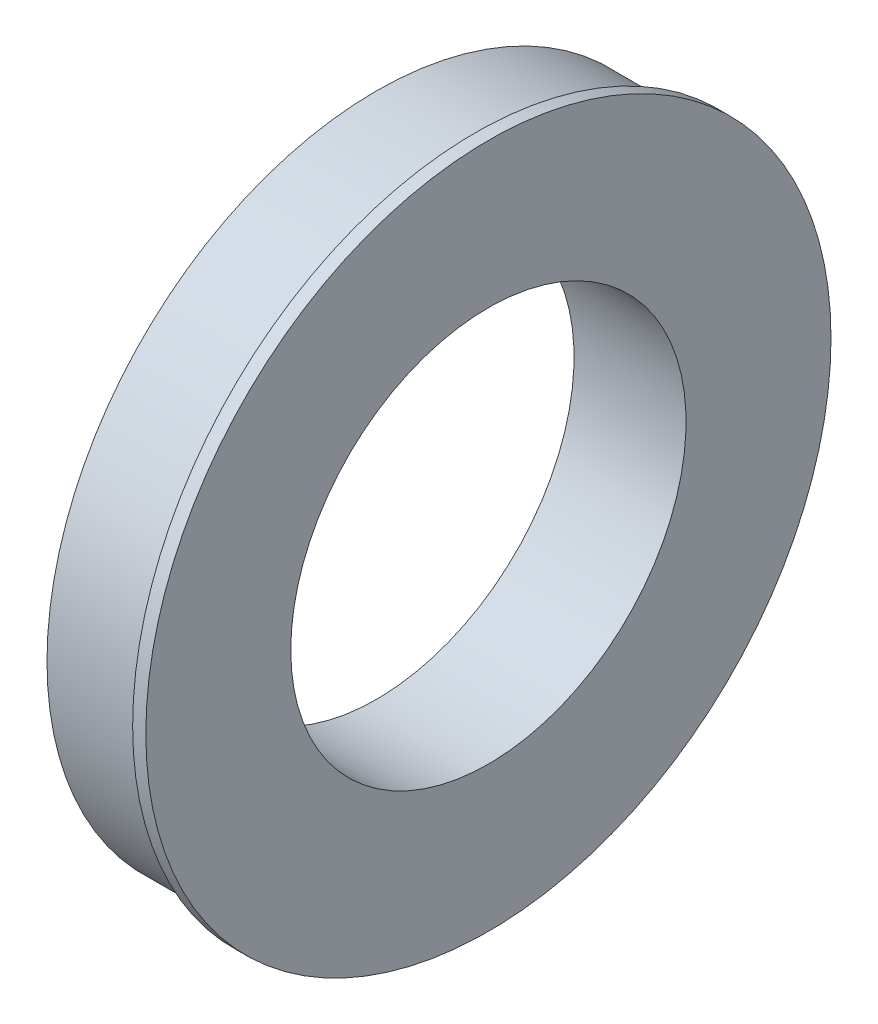
ISO-10303-21;
HEADER;
FILE_DESCRIPTION(('STEP AP214'),'2;1');
FILE_NAME('part.step','',(''),(''),'','','');
FILE_SCHEMA(('AUTOMOTIVE_DESIGN { 1 0 10303 214 1 1 1 1 }'));
ENDSEC;
DATA;
#1=APPLICATION_CONTEXT('core data for automotive mechanical design processes');
#2=APPLICATION_PROTOCOL_DEFINITION('international standard','automotive_design',2000,#1);
#3=PRODUCT_CONTEXT('',#1,'mechanical');
#4=PRODUCT('Part','Part','',(#3));
#5=PRODUCT_RELATED_PRODUCT_CATEGORY('part','',(#4));
#6=PRODUCT_DEFINITION_FORMATION('','',#4);
#7=PRODUCT_DEFINITION_CONTEXT('part definition',#1,'design');
#8=PRODUCT_DEFINITION('design','',#6,#7);
#9=PRODUCT_DEFINITION_SHAPE('','',#8);
#10=(LENGTH_UNIT() NAMED_UNIT(*) SI_UNIT(.MILLI.,.METRE.));
#11=(NAMED_UNIT(*) PLANE_ANGLE_UNIT() SI_UNIT($,.RADIAN.));
#12=(NAMED_UNIT(*) SI_UNIT($,.STERADIAN.) SOLID_ANGLE_UNIT());
#13=UNCERTAINTY_MEASURE_WITH_UNIT(LENGTH_MEASURE(1.E-05),#10,'distance_accuracy_value','');
#14=(GEOMETRIC_REPRESENTATION_CONTEXT(3) GLOBAL_UNCERTAINTY_ASSIGNED_CONTEXT((#13)) GLOBAL_UNIT_ASSIGNED_CONTEXT((#10,
#11,#12)) REPRESENTATION_CONTEXT('',''));
#15=CARTESIAN_POINT('',(0.,0.,0.));
#16=DIRECTION('',(0.,0.,1.));
#17=DIRECTION('',(1.,0.,0.));
#18=AXIS2_PLACEMENT_3D('',#15,#16,#17);
#19=CARTESIAN_POINT('',(0.,0.,0.));
#20=DIRECTION('',(1.,0.,0.));
#21=DIRECTION('',(0.,0.,-1.));
#22=AXIS2_PLACEMENT_3D('',#19,#20,#21);
#23=PLANE('',#22);
#24=CARTESIAN_POINT('',(0.,0.,0.));
#25=DIRECTION('',(1.,0.,0.));
#26=DIRECTION('',(0.,0.,-1.));
#27=AXIS2_PLACEMENT_3D('',#24,#25,#26);
#28=CIRCLE('',#27,63.5);
#29=CARTESIAN_POINT('',(0.,0.,63.5));
#30=VERTEX_POINT('',#29);
#31=EDGE_CURVE('E41',#30,#30,#28,.T.);
#32=ORIENTED_EDGE('',*,*,#31,.F.);
#33=EDGE_LOOP('',(#32));
#34=FACE_BOUND('',#33,.T.);
#35=CARTESIAN_POINT('',(0.,0.,0.));
#36=DIRECTION('',(1.,0.,0.));
#37=DIRECTION('',(0.,0.,-1.));
#38=AXIS2_PLACEMENT_3D('',#35,#36,#37);
#39=CIRCLE('',#38,38.1);
#40=CARTESIAN_POINT('',(0.,0.,38.1));
#41=VERTEX_POINT('',#40);
#42=EDGE_CURVE('E50',#41,#41,#39,.T.);
#43=ORIENTED_EDGE('',*,*,#42,.T.);
#44=EDGE_LOOP('',(#43));
#45=FACE_BOUND('',#44,.T.);
#46=ADVANCED_FACE('F37',(#34,#45),#23,.F.);
#47=CARTESIAN_POINT('',(19.05,0.,0.));
#48=DIRECTION('',(-1.,0.,0.));
#49=DIRECTION('',(0.,0.,1.));
#50=AXIS2_PLACEMENT_3D('',#47,#48,#49);
#51=CYLINDRICAL_SURFACE('',#50,63.5);
#52=CARTESIAN_POINT('',(19.05,0.,0.));
#53=DIRECTION('',(1.,0.,0.));
#54=DIRECTION('',(0.,0.,-1.));
#55=AXIS2_PLACEMENT_3D('',#52,#53,#54);
#56=CIRCLE('',#55,63.5);
#57=CARTESIAN_POINT('',(19.05,0.,63.5));
#58=VERTEX_POINT('',#57);
#59=EDGE_CURVE('E10',#58,#58,#56,.T.);
#60=CARTESIAN_POINT('',(19.05,0.,63.5));
#61=CARTESIAN_POINT('',(18.8515625,0.,63.5));
#62=CARTESIAN_POINT('',(18.653125,0.,63.5));
#63=CARTESIAN_POINT('',(18.25625,0.,63.5));
#64=CARTESIAN_POINT('',(18.0578125,0.,63.5));
#65=CARTESIAN_POINT('',(17.6609375,0.,63.5));
#66=CARTESIAN_POINT('',(17.4625,0.,63.5));
#67=CARTESIAN_POINT('',(17.065625,0.,63.5));
#68=CARTESIAN_POINT('',(16.8671875,0.,63.5));
#69=CARTESIAN_POINT('',(16.4703125,0.,63.5));
#70=CARTESIAN_POINT('',(16.271875,0.,63.5));
#71=CARTESIAN_POINT('',(15.875,0.,63.5));
#72=CARTESIAN_POINT('',(15.6765625,0.,63.5));
#73=CARTESIAN_POINT('',(15.2796875,0.,63.5));
#74=CARTESIAN_POINT('',(15.08125,0.,63.5));
#75=CARTESIAN_POINT('',(14.684375,0.,63.5));
#76=CARTESIAN_POINT('',(14.4859375,0.,63.5));
#77=CARTESIAN_POINT('',(14.0890625,0.,63.5));
#78=CARTESIAN_POINT('',(13.890625,0.,63.5));
#79=CARTESIAN_POINT('',(13.49375,0.,63.5));
#80=CARTESIAN_POINT('',(13.2953125,0.,63.5));
#81=CARTESIAN_POINT('',(12.8984375,0.,63.5));
#82=CARTESIAN_POINT('',(12.7,0.,63.5));
#83=CARTESIAN_POINT('',(12.303125,0.,63.5));
#84=CARTESIAN_POINT('',(12.1046875,0.,63.5));
#85=CARTESIAN_POINT('',(11.7078125,0.,63.5));
#86=CARTESIAN_POINT('',(11.509375,0.,63.5));
#87=CARTESIAN_POINT('',(11.1125,0.,63.5));
#88=CARTESIAN_POINT('',(10.9140625,0.,63.5));
#89=CARTESIAN_POINT('',(10.5171875,0.,63.5));
#90=CARTESIAN_POINT('',(10.31875,0.,63.5));
#91=CARTESIAN_POINT('',(9.921875,0.,63.5));
#92=CARTESIAN_POINT('',(9.7234375,0.,63.5));
#93=CARTESIAN_POINT('',(9.3265625,0.,63.5));
#94=CARTESIAN_POINT('',(9.128125,0.,63.5));
#95=CARTESIAN_POINT('',(8.73125,0.,63.5));
#96=CARTESIAN_POINT('',(8.5328125,0.,63.5));
#97=CARTESIAN_POINT('',(8.1359375,0.,63.5));
#98=CARTESIAN_POINT('',(7.9375,0.,63.5));
#99=CARTESIAN_POINT('',(7.540625,0.,63.5));
#100=CARTESIAN_POINT('',(7.3421875,0.,63.5));
#101=CARTESIAN_POINT('',(6.9453125,0.,63.5));
#102=CARTESIAN_POINT('',(6.746875,0.,63.5));
#103=CARTESIAN_POINT('',(6.35,0.,63.5));
#104=CARTESIAN_POINT('',(6.1515625,0.,63.5));
#105=CARTESIAN_POINT('',(5.7546875,0.,63.5));
#106=CARTESIAN_POINT('',(5.55625,0.,63.5));
#107=CARTESIAN_POINT('',(5.159375,0.,63.5));
#108=CARTESIAN_POINT('',(4.9609375,0.,63.5));
#109=CARTESIAN_POINT('',(4.5640625,0.,63.5));
#110=CARTESIAN_POINT('',(4.365625,0.,63.5));
#111=CARTESIAN_POINT('',(3.96875,0.,63.5));
#112=CARTESIAN_POINT('',(3.7703125,0.,63.5));
#113=CARTESIAN_POINT('',(3.3734375,0.,63.5));
#114=CARTESIAN_POINT('',(3.175,0.,63.5));
#115=CARTESIAN_POINT('',(2.778125,0.,63.5));
#116=CARTESIAN_POINT('',(2.5796875,0.,63.5));
#117=CARTESIAN_POINT('',(2.1828125,0.,63.5));
#118=CARTESIAN_POINT('',(1.984375,0.,63.5));
#119=CARTESIAN_POINT('',(1.5875,0.,63.5));
#120=CARTESIAN_POINT('',(1.3890625,0.,63.5));
#121=CARTESIAN_POINT('',(0.992187500000001,0.,63.5));
#122=CARTESIAN_POINT('',(0.793750000000001,0.,63.5));
#123=CARTESIAN_POINT('',(0.396875,0.,63.5));
#124=CARTESIAN_POINT('',(0.1984375,0.,63.5));
#125=CARTESIAN_POINT('',(0.,0.,63.5));
#126=B_SPLINE_CURVE_WITH_KNOTS('',3,(#60,#61,#62,#63,#64,#65,#66,#67,#68,#69,#70,#71,#72,#73,
#74,#75,#76,#77,#78,#79,#80,#81,#82,#83,#84,#85,#86,#87,#88,#89,#90,#91,#92,#93,#94,#95,#96,#97,
#98,#99,#100,#101,#102,#103,#104,#105,#106,#107,#108,#109,#110,#111,#112,#113,#114,#115,#116,
#117,#118,#119,#120,#121,#122,#123,#124,#125),.UNSPECIFIED.,.F.,.F.,(4,2,2,2,2,2,2,2,2,2,2,2,2,
2,2,2,2,2,2,2,2,2,2,2,2,2,2,2,2,2,2,2,4),(0.,0.5953125,1.190625,1.7859375,2.38125,2.9765625,
3.571875,4.1671875,4.7625,5.3578125,5.953125,6.5484375,7.14375,7.7390625,8.334375,8.9296875,
9.525,10.1203125,10.715625,11.3109375,11.90625,12.5015625,13.096875,13.6921875,14.2875,
14.8828125,15.478125,16.0734375,16.66875,17.2640625,17.859375,18.4546875,19.05),.UNSPECIFIED.);
#127=EDGE_CURVE('BSEAM39',#58,#30,#126,.T.);
#128=ORIENTED_EDGE('',*,*,#59,.F.);
#129=ORIENTED_EDGE('',*,*,#31,.T.);
#130=ORIENTED_EDGE('',*,*,#127,.T.);
#131=ORIENTED_EDGE('',*,*,#127,.F.);
#132=EDGE_LOOP('',(#128,#130,#129,#131));
#133=FACE_BOUND('',#132,.T.);
#134=ADVANCED_FACE('F39',(#133),#51,.T.);
#135=CARTESIAN_POINT('',(19.05,0.,0.));
#136=DIRECTION('',(-1.,0.,0.));
#137=DIRECTION('',(0.,0.,1.));
#138=AXIS2_PLACEMENT_3D('',#135,#136,#137);
#139=CYLINDRICAL_SURFACE('',#138,38.1);
#140=CARTESIAN_POINT('',(21.59,0.,0.));
#141=DIRECTION('',(1.,0.,0.));
#142=DIRECTION('',(0.,0.,-1.));
#143=AXIS2_PLACEMENT_3D('',#140,#141,#142);
#144=CIRCLE('',#143,38.1);
#145=CARTESIAN_POINT('',(21.59,0.,38.1));
#146=VERTEX_POINT('',#145);
#147=EDGE_CURVE('E60',#146,#146,#144,.T.);
#148=CARTESIAN_POINT('',(0.,0.,38.1));
#149=CARTESIAN_POINT('',(0.224895833333333,0.,38.1));
#150=CARTESIAN_POINT('',(0.449791666666667,0.,38.1));
#151=CARTESIAN_POINT('',(0.899583333333333,0.,38.1));
#152=CARTESIAN_POINT('',(1.12447916666667,0.,38.1));
#153=CARTESIAN_POINT('',(1.57427083333333,0.,38.1));
#154=CARTESIAN_POINT('',(1.79916666666667,0.,38.1));
#155=CARTESIAN_POINT('',(2.24895833333333,0.,38.1));
#156=CARTESIAN_POINT('',(2.47385416666667,0.,38.1));
#157=CARTESIAN_POINT('',(2.92364583333333,0.,38.1));
#158=CARTESIAN_POINT('',(3.14854166666667,0.,38.1));
#159=CARTESIAN_POINT('',(3.59833333333333,0.,38.1));
#160=CARTESIAN_POINT('',(3.82322916666667,0.,38.1));
#161=CARTESIAN_POINT('',(4.27302083333333,0.,38.1));
#162=CARTESIAN_POINT('',(4.49791666666667,0.,38.1));
#163=CARTESIAN_POINT('',(4.94770833333333,0.,38.1));
#164=CARTESIAN_POINT('',(5.17260416666667,0.,38.1));
#165=CARTESIAN_POINT('',(5.62239583333333,0.,38.1));
#166=CARTESIAN_POINT('',(5.84729166666667,0.,38.1));
#167=CARTESIAN_POINT('',(6.29708333333333,0.,38.1));
#168=CARTESIAN_POINT('',(6.52197916666667,0.,38.1));
#169=CARTESIAN_POINT('',(6.97177083333333,0.,38.1));
#170=CARTESIAN_POINT('',(7.19666666666667,0.,38.1));
#171=CARTESIAN_POINT('',(7.64645833333333,0.,38.1));
#172=CARTESIAN_POINT('',(7.87135416666667,0.,38.1));
#173=CARTESIAN_POINT('',(8.32114583333333,0.,38.1));
#174=CARTESIAN_POINT('',(8.54604166666667,0.,38.1));
#175=CARTESIAN_POINT('',(8.99583333333334,0.,38.1));
#176=CARTESIAN_POINT('',(9.22072916666667,0.,38.1));
#177=CARTESIAN_POINT('',(9.67052083333333,0.,38.1));
#178=CARTESIAN_POINT('',(9.89541666666667,0.,38.1));
#179=CARTESIAN_POINT('',(10.3452083333333,0.,38.1));
#180=CARTESIAN_POINT('',(10.5701041666667,0.,38.1));
#181=CARTESIAN_POINT('',(11.0198958333333,0.,38.1));
#182=CARTESIAN_POINT('',(11.2447916666667,0.,38.1));
#183=CARTESIAN_POINT('',(11.6945833333333,0.,38.1));
#184=CARTESIAN_POINT('',(11.9194791666667,0.,38.1));
#185=CARTESIAN_POINT('',(12.3692708333333,0.,38.1));
#186=CARTESIAN_POINT('',(12.5941666666667,0.,38.1));
#187=CARTESIAN_POINT('',(13.0439583333333,0.,38.1));
#188=CARTESIAN_POINT('',(13.2688541666667,0.,38.1));
#189=CARTESIAN_POINT('',(13.7186458333333,0.,38.1));
#190=CARTESIAN_POINT('',(13.9435416666667,0.,38.1));
#191=CARTESIAN_POINT('',(14.3933333333333,0.,38.1));
#192=CARTESIAN_POINT('',(14.6182291666667,0.,38.1));
#193=CARTESIAN_POINT('',(15.0680208333333,0.,38.1));
#194=CARTESIAN_POINT('',(15.2929166666667,0.,38.1));
#195=CARTESIAN_POINT('',(15.7427083333333,0.,38.1));
#196=CARTESIAN_POINT('',(15.9676041666667,0.,38.1));
#197=CARTESIAN_POINT('',(16.4173958333333,0.,38.1));
#198=CARTESIAN_POINT('',(16.6422916666667,0.,38.1));
#199=CARTESIAN_POINT('',(17.0920833333333,0.,38.1));
#200=CARTESIAN_POINT('',(17.3169791666667,0.,38.1));
#201=CARTESIAN_POINT('',(17.7667708333333,0.,38.1));
#202=CARTESIAN_POINT('',(17.9916666666667,0.,38.1));
#203=CARTESIAN_POINT('',(18.4414583333333,0.,38.1));
#204=CARTESIAN_POINT('',(18.6663541666667,0.,38.1));
#205=CARTESIAN_POINT('',(19.1161458333333,0.,38.1));
#206=CARTESIAN_POINT('',(19.3410416666667,0.,38.1));
#207=CARTESIAN_POINT('',(19.7908333333333,0.,38.1));
#208=CARTESIAN_POINT('',(20.0157291666667,0.,38.1));
#209=CARTESIAN_POINT('',(20.4655208333333,0.,38.1));
#210=CARTESIAN_POINT('',(20.6904166666667,0.,38.1));
#211=CARTESIAN_POINT('',(21.1402083333333,0.,38.1));
#212=CARTESIAN_POINT('',(21.3651041666667,0.,38.1));
#213=CARTESIAN_POINT('',(21.59,0.,38.1));
#214=B_SPLINE_CURVE_WITH_KNOTS('',3,(#148,#149,#150,#151,#152,#153,#154,#155,#156,#157,#158,
#159,#160,#161,#162,#163,#164,#165,#166,#167,#168,#169,#170,#171,#172,#173,#174,#175,#176,#177,
#178,#179,#180,#181,#182,#183,#184,#185,#186,#187,#188,#189,#190,#191,#192,#193,#194,#195,#196,
#197,#198,#199,#200,#201,#202,#203,#204,#205,#206,#207,#208,#209,#210,#211,#212,#213),
.UNSPECIFIED.,.F.,.F.,(4,2,2,2,2,2,2,2,2,2,2,2,2,2,2,2,2,2,2,2,2,2,2,2,2,2,2,2,2,2,2,2,4),(0.,
0.6746875,1.349375,2.0240625,2.69875,3.3734375,4.048125,4.7228125,5.3975,6.0721875,6.746875,
7.4215625,8.09625,8.7709375,9.445625,10.1203125,10.795,11.4696875,12.144375,12.8190625,13.49375,
14.1684375,14.843125,15.5178125,16.1925,16.8671875,17.541875,18.2165625,18.89125,19.5659375,
20.240625,20.9153125,21.59),.UNSPECIFIED.);
#215=EDGE_CURVE('BSEAM68',#41,#146,#214,.T.);
#216=ORIENTED_EDGE('',*,*,#42,.F.);
#217=ORIENTED_EDGE('',*,*,#147,.T.);
#218=ORIENTED_EDGE('',*,*,#215,.T.);
#219=ORIENTED_EDGE('',*,*,#215,.F.);
#220=EDGE_LOOP('',(#216,#218,#217,#219));
#221=FACE_BOUND('',#220,.T.);
#222=ADVANCED_FACE('F68',(#221),#139,.F.);
#223=CARTESIAN_POINT('',(21.59,0.,0.));
#224=DIRECTION('',(1.,0.,0.));
#225=DIRECTION('',(0.,0.,-1.));
#226=AXIS2_PLACEMENT_3D('',#223,#224,#225);
#227=PLANE('',#226);
#228=CARTESIAN_POINT('',(21.59,0.,0.));
#229=DIRECTION('',(1.,0.,0.));
#230=DIRECTION('',(0.,0.,-1.));
#231=AXIS2_PLACEMENT_3D('',#228,#229,#230);
#232=CIRCLE('',#231,66.04);
#233=CARTESIAN_POINT('',(21.59,0.,-66.04));
#234=VERTEX_POINT('',#233);
#235=EDGE_CURVE('E55',#234,#234,#232,.T.);
#236=ORIENTED_EDGE('',*,*,#235,.T.);
#237=EDGE_LOOP('',(#236));
#238=FACE_BOUND('',#237,.T.);
#239=ORIENTED_EDGE('',*,*,#147,.F.);
#240=EDGE_LOOP('',(#239));
#241=FACE_BOUND('',#240,.T.);
#242=ADVANCED_FACE('F70',(#238,#241),#227,.T.);
#243=CARTESIAN_POINT('',(19.05,0.,0.));
#244=DIRECTION('',(1.,0.,0.));
#245=DIRECTION('',(0.,0.,-1.));
#246=AXIS2_PLACEMENT_3D('',#243,#244,#245);
#247=PLANE('',#246);
#248=ORIENTED_EDGE('',*,*,#59,.T.);
#249=EDGE_LOOP('',(#248));
#250=FACE_BOUND('',#249,.T.);
#251=CARTESIAN_POINT('',(19.05,0.,0.));
#252=DIRECTION('',(1.,0.,0.));
#253=DIRECTION('',(0.,0.,-1.));
#254=AXIS2_PLACEMENT_3D('',#251,#252,#253);
#255=CIRCLE('',#254,66.04);
#256=CARTESIAN_POINT('',(19.05,0.,-66.04));
#257=VERTEX_POINT('',#256);
#258=EDGE_CURVE('E56',#257,#257,#255,.T.);
#259=ORIENTED_EDGE('',*,*,#258,.F.);
#260=EDGE_LOOP('',(#259));
#261=FACE_BOUND('',#260,.T.);
#262=ADVANCED_FACE('F72',(#250,#261),#247,.F.);
#263=CARTESIAN_POINT('',(21.59,0.,0.));
#264=DIRECTION('',(-1.,0.,0.));
#265=DIRECTION('',(0.,0.,1.));
#266=AXIS2_PLACEMENT_3D('',#263,#264,#265);
#267=CYLINDRICAL_SURFACE('',#266,66.04);
#268=ORIENTED_EDGE('',*,*,#235,.F.);
#269=EDGE_LOOP('',(#268));
#270=FACE_BOUND('',#269,.T.);
#271=ORIENTED_EDGE('',*,*,#258,.T.);
#272=EDGE_LOOP('',(#271));
#273=FACE_BOUND('',#272,.T.);
#274=ADVANCED_FACE('F79',(#270,#273),#267,.T.);
#275=CLOSED_SHELL('',(#46,#134,#222,#242,#262,#274));
#276=MANIFOLD_SOLID_BREP('B2',#275);
#277=ADVANCED_BREP_SHAPE_REPRESENTATION('',(#18,#276),#14);
#278=SHAPE_DEFINITION_REPRESENTATION(#9,#277);
ENDSEC;
END-ISO-10303-21;
